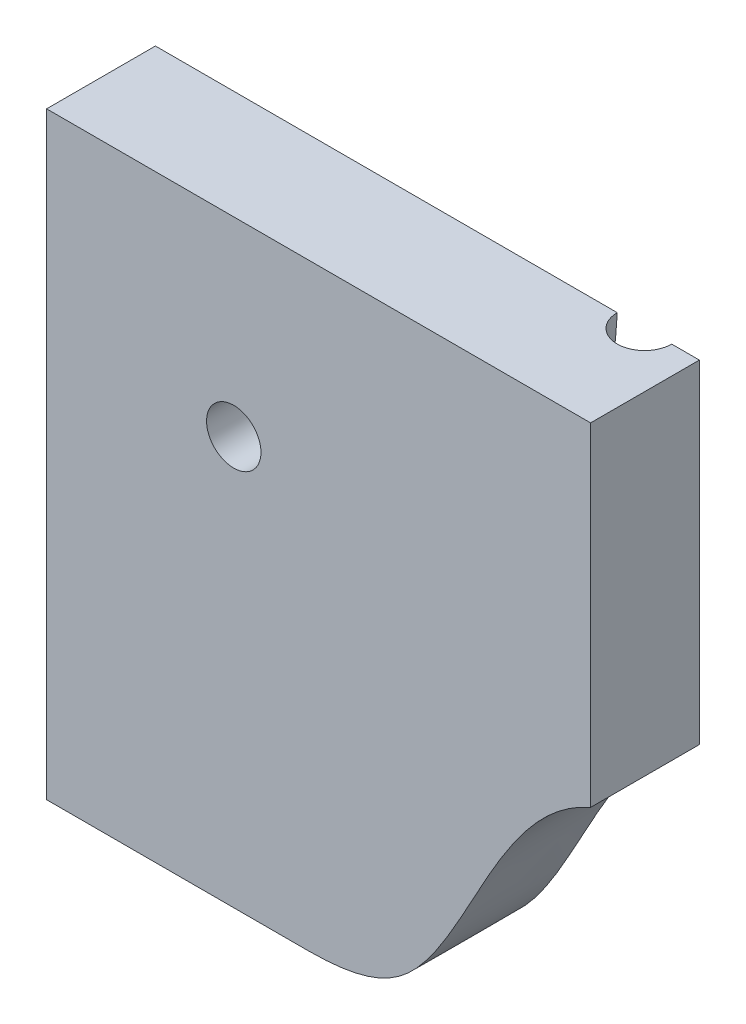
ISO-10303-21;
HEADER;
FILE_DESCRIPTION(('STEP AP214'),'2;1');
FILE_NAME('part.step','',(''),(''),'','','');
FILE_SCHEMA(('AUTOMOTIVE_DESIGN { 1 0 10303 214 1 1 1 1 }'));
ENDSEC;
DATA;
#1=APPLICATION_CONTEXT('core data for automotive mechanical design processes');
#2=APPLICATION_PROTOCOL_DEFINITION('international standard','automotive_design',2000,#1);
#3=PRODUCT_CONTEXT('',#1,'mechanical');
#4=PRODUCT('Part','Part','',(#3));
#5=PRODUCT_RELATED_PRODUCT_CATEGORY('part','',(#4));
#6=PRODUCT_DEFINITION_FORMATION('','',#4);
#7=PRODUCT_DEFINITION_CONTEXT('part definition',#1,'design');
#8=PRODUCT_DEFINITION('design','',#6,#7);
#9=PRODUCT_DEFINITION_SHAPE('','',#8);
#10=(LENGTH_UNIT() NAMED_UNIT(*) SI_UNIT(.MILLI.,.METRE.));
#11=(NAMED_UNIT(*) PLANE_ANGLE_UNIT() SI_UNIT($,.RADIAN.));
#12=(NAMED_UNIT(*) SI_UNIT($,.STERADIAN.) SOLID_ANGLE_UNIT());
#13=UNCERTAINTY_MEASURE_WITH_UNIT(LENGTH_MEASURE(1.E-05),#10,'distance_accuracy_value','');
#14=(GEOMETRIC_REPRESENTATION_CONTEXT(3) GLOBAL_UNCERTAINTY_ASSIGNED_CONTEXT((#13)) GLOBAL_UNIT_ASSIGNED_CONTEXT((#10,
#11,#12)) REPRESENTATION_CONTEXT('',''));
#15=CARTESIAN_POINT('',(0.,0.,0.));
#16=DIRECTION('',(0.,0.,1.));
#17=DIRECTION('',(1.,0.,0.));
#18=AXIS2_PLACEMENT_3D('',#15,#16,#17);
#19=CARTESIAN_POINT('',(38.2647547534457,10.0098254795269,0.));
#20=DIRECTION('',(0.,0.,-1.));
#21=DIRECTION('',(-1.,0.,0.));
#22=AXIS2_PLACEMENT_3D('',#19,#20,#21);
#23=PLANE('',#22);
#24=CARTESIAN_POINT('',(17.2,37.5,0.));
#25=DIRECTION('',(0.,0.,-1.));
#26=DIRECTION('',(-1.,0.,0.));
#27=AXIS2_PLACEMENT_3D('',#24,#25,#26);
#28=CIRCLE('',#27,2.5000000000842);
#29=CARTESIAN_POINT('',(14.6999999999158,37.5,0.));
#30=VERTEX_POINT('',#29);
#31=EDGE_CURVE('E160',#30,#30,#28,.F.);
#32=ORIENTED_EDGE('',*,*,#31,.T.);
#33=EDGE_LOOP('',(#32));
#34=FACE_BOUND('',#33,.T.);
#35=CARTESIAN_POINT('',(42.5,57.,0.));
#36=CARTESIAN_POINT('',(42.5000000006538,51.9253380487951,0.));
#37=CARTESIAN_POINT('',(41.5531151539756,46.4013222350396,0.));
#38=CARTESIAN_POINT('',(38.3409411286107,38.4417646806979,0.));
#39=CARTESIAN_POINT('',(36.973235797455,35.8352441280092,0.));
#40=CARTESIAN_POINT('',(33.6915817568519,30.9261746060751,0.));
#41=CARTESIAN_POINT('',(31.771503076357,28.6150238978217,0.));
#42=CARTESIAN_POINT('',(27.4982759398184,24.4580256174074,0.));
#43=CARTESIAN_POINT('',(25.1383219375729,22.6054937700866,0.));
#44=CARTESIAN_POINT('',(20.1558797146555,19.4679096422306,0.));
#45=CARTESIAN_POINT('',(17.5261590397284,18.1774846024586,0.));
#46=CARTESIAN_POINT('',(12.1919874742694,16.1868966847282,0.));
#47=CARTESIAN_POINT('',(9.47903854419933,15.4827671330933,0.));
#48=CARTESIAN_POINT('',(4.15156445206141,14.6172527598869,0.));
#49=CARTESIAN_POINT('',(1.52516480725778,14.4582368787778,0.));
#50=CARTESIAN_POINT('',(-1.00015293756699,14.5108584228348,0.));
#51=B_SPLINE_CURVE_WITH_KNOTS('',3,(#35,#36,#37,#38,#39,#40,#41,#42,#43,#44,#45,#46,#47,#48,#49,
#50),.UNSPECIFIED.,.F.,.F.,(4,2,2,2,2,2,2,4),(0.,0.25,0.375,0.5,0.625,0.75,0.875,1.),.UNSPECIFIED.);
#52=CARTESIAN_POINT('',(0.,14.5012176124524,0.));
#53=VERTEX_POINT('',#52);
#54=CARTESIAN_POINT('',(42.4514698092519,55.,0.));
#55=VERTEX_POINT('',#54);
#56=EDGE_CURVE('E11',#53,#55,#51,.F.);
#57=ORIENTED_EDGE('',*,*,#56,.F.);
#58=DIRECTION('',(0.,-1.,0.));
#59=VECTOR('',#58,1.);
#60=CARTESIAN_POINT('',(0.,0.,0.));
#61=LINE('',#60,#59);
#62=CARTESIAN_POINT('',(0.,55.,0.));
#63=VERTEX_POINT('',#62);
#64=EDGE_CURVE('E138',#63,#53,#61,.T.);
#65=ORIENTED_EDGE('',*,*,#64,.F.);
#66=DIRECTION('',(-1.,0.,0.));
#67=VECTOR('',#66,1.);
#68=CARTESIAN_POINT('',(0.,55.,0.));
#69=LINE('',#68,#67);
#70=EDGE_CURVE('E135',#55,#63,#69,.T.);
#71=ORIENTED_EDGE('',*,*,#70,.F.);
#72=EDGE_LOOP('',(#57,#65,#71));
#73=FACE_BOUND('',#72,.T.);
#74=ADVANCED_FACE('F33',(#34,#73),#23,.T.);
#75=CARTESIAN_POINT('',(0.,0.,10.));
#76=DIRECTION('',(0.,1.,0.));
#77=DIRECTION('',(0.,0.,1.));
#78=AXIS2_PLACEMENT_3D('',#75,#76,#77);
#79=PLANE('',#78);
#80=DIRECTION('',(1.,0.,0.));
#81=VECTOR('',#80,1.);
#82=CARTESIAN_POINT('',(0.,0.,0.));
#83=LINE('',#82,#81);
#84=CARTESIAN_POINT('',(0.,0.,0.));
#85=VERTEX_POINT('',#84);
#86=CARTESIAN_POINT('',(24.,0.,0.));
#87=VERTEX_POINT('',#86);
#88=EDGE_CURVE('E124',#85,#87,#83,.T.);
#89=ORIENTED_EDGE('',*,*,#88,.T.);
#90=DIRECTION('',(0.,0.,-1.));
#91=VECTOR('',#90,1.);
#92=CARTESIAN_POINT('',(24.,0.,10.));
#93=LINE('',#92,#91);
#94=CARTESIAN_POINT('',(24.,0.,10.));
#95=VERTEX_POINT('',#94);
#96=EDGE_CURVE('E145',#95,#87,#93,.T.);
#97=ORIENTED_EDGE('',*,*,#96,.F.);
#98=DIRECTION('',(1.,0.,0.));
#99=VECTOR('',#98,1.);
#100=CARTESIAN_POINT('',(0.,0.,10.));
#101=LINE('',#100,#99);
#102=CARTESIAN_POINT('',(0.,0.,10.));
#103=VERTEX_POINT('',#102);
#104=EDGE_CURVE('E141',#103,#95,#101,.T.);
#105=ORIENTED_EDGE('',*,*,#104,.F.);
#106=DIRECTION('',(0.,0.,-1.));
#107=VECTOR('',#106,1.);
#108=CARTESIAN_POINT('',(0.,0.,10.));
#109=LINE('',#108,#107);
#110=EDGE_CURVE('E120',#103,#85,#109,.T.);
#111=ORIENTED_EDGE('',*,*,#110,.T.);
#112=EDGE_LOOP('',(#89,#97,#105,#111));
#113=FACE_BOUND('',#112,.T.);
#114=ADVANCED_FACE('F35',(#113),#79,.F.);
#115=CARTESIAN_POINT('',(24.,0.,10.));
#116=CARTESIAN_POINT('',(29.8352147172741,0.,10.));
#117=CARTESIAN_POINT('',(38.1427017924434,5.23965862310339,10.));
#118=CARTESIAN_POINT('',(42.219386104431,21.0249690236079,10.));
#119=CARTESIAN_POINT('',(50.,24.39,10.));
#120=B_SPLINE_CURVE_WITH_KNOTS('',3,(#115,#116,#117,#118,#119),.UNSPECIFIED.,.F.,.F.,(4,1,4),
(0.,0.308376464465962,1.),.UNSPECIFIED.);
#121=DIRECTION('',(0.,0.,-1.));
#122=VECTOR('',#121,1.);
#123=SURFACE_OF_LINEAR_EXTRUSION('',#120,#122);
#124=CARTESIAN_POINT('',(24.,0.,0.));
#125=CARTESIAN_POINT('',(29.8352147172741,0.,0.));
#126=CARTESIAN_POINT('',(38.1427017924434,5.23965862310339,0.));
#127=CARTESIAN_POINT('',(42.219386104431,21.0249690236079,0.));
#128=CARTESIAN_POINT('',(50.,24.39,0.));
#129=B_SPLINE_CURVE_WITH_KNOTS('',3,(#124,#125,#126,#127,#128),.UNSPECIFIED.,.F.,.F.,(4,1,4),
(0.,0.308376464465962,1.),.UNSPECIFIED.);
#130=CARTESIAN_POINT('',(50.,24.39,0.));
#131=VERTEX_POINT('',#130);
#132=EDGE_CURVE('E127',#87,#131,#129,.T.);
#133=ORIENTED_EDGE('',*,*,#132,.T.);
#134=DIRECTION('',(0.,0.,-1.));
#135=VECTOR('',#134,1.);
#136=CARTESIAN_POINT('',(50.,24.39,10.));
#137=LINE('',#136,#135);
#138=CARTESIAN_POINT('',(50.,24.39,10.));
#139=VERTEX_POINT('',#138);
#140=EDGE_CURVE('E114',#139,#131,#137,.T.);
#141=ORIENTED_EDGE('',*,*,#140,.F.);
#142=EDGE_CURVE('E91',#95,#139,#120,.T.);
#143=ORIENTED_EDGE('',*,*,#142,.F.);
#144=ORIENTED_EDGE('',*,*,#96,.T.);
#145=EDGE_LOOP('',(#133,#141,#143,#144));
#146=FACE_BOUND('',#145,.T.);
#147=ADVANCED_FACE('F212',(#146),#123,.F.);
#148=CARTESIAN_POINT('',(50.,55.,10.));
#149=DIRECTION('',(-1.,0.,0.));
#150=DIRECTION('',(0.,-1.,0.));
#151=AXIS2_PLACEMENT_3D('',#148,#149,#150);
#152=PLANE('',#151);
#153=DIRECTION('',(0.,1.,0.));
#154=VECTOR('',#153,1.);
#155=CARTESIAN_POINT('',(50.,55.,0.));
#156=LINE('',#155,#154);
#157=CARTESIAN_POINT('',(50.,55.,0.));
#158=VERTEX_POINT('',#157);
#159=EDGE_CURVE('E110',#131,#158,#156,.T.);
#160=ORIENTED_EDGE('',*,*,#159,.T.);
#161=DIRECTION('',(0.,0.,-1.));
#162=VECTOR('',#161,1.);
#163=CARTESIAN_POINT('',(50.,55.,10.));
#164=LINE('',#163,#162);
#165=CARTESIAN_POINT('',(50.,55.,10.));
#166=VERTEX_POINT('',#165);
#167=EDGE_CURVE('E107',#166,#158,#164,.T.);
#168=ORIENTED_EDGE('',*,*,#167,.F.);
#169=DIRECTION('',(0.,1.,0.));
#170=VECTOR('',#169,1.);
#171=CARTESIAN_POINT('',(50.,55.,10.));
#172=LINE('',#171,#170);
#173=EDGE_CURVE('E97',#139,#166,#172,.T.);
#174=ORIENTED_EDGE('',*,*,#173,.F.);
#175=ORIENTED_EDGE('',*,*,#140,.T.);
#176=EDGE_LOOP('',(#160,#168,#174,#175));
#177=FACE_BOUND('',#176,.T.);
#178=ADVANCED_FACE('F108',(#177),#152,.F.);
#179=CARTESIAN_POINT('',(0.,55.,10.));
#180=DIRECTION('',(0.,-1.,0.));
#181=DIRECTION('',(0.,0.,-1.));
#182=AXIS2_PLACEMENT_3D('',#179,#180,#181);
#183=PLANE('',#182);
#184=CARTESIAN_POINT('',(47.4568555946469,55.,0.));
#185=VERTEX_POINT('',#184);
#186=EDGE_CURVE('E136',#158,#185,#69,.T.);
#187=ORIENTED_EDGE('',*,*,#186,.T.);
#188=CARTESIAN_POINT('',(47.4568555946469,55.,0.));
#189=CARTESIAN_POINT('',(47.4568623708793,55.,0.0702648939159161));
#190=CARTESIAN_POINT('',(47.4538904852355,55.,0.140526573017456));
#191=CARTESIAN_POINT('',(47.442041824152,55.,0.280546893510559));
#192=CARTESIAN_POINT('',(47.4331653421898,55.,0.350305559729305));
#193=CARTESIAN_POINT('',(47.40956851912,55.,0.488779823353157));
#194=CARTESIAN_POINT('',(47.3948524440054,55.,0.557496144259975));
#195=CARTESIAN_POINT('',(47.3596963979197,55.,0.693427968661049));
#196=CARTESIAN_POINT('',(47.3392564945323,55.,0.760643489865761));
#197=CARTESIAN_POINT('',(47.2695183998098,55.,0.959387102448081));
#198=CARTESIAN_POINT('',(47.211791561359,55.,1.08807213968848));
#199=CARTESIAN_POINT('',(47.0756008847293,55.,1.33383292830919));
#200=CARTESIAN_POINT('',(46.997140974646,55.,1.45091087300155));
#201=CARTESIAN_POINT('',(46.8216505600416,55.,1.67031486399083));
#202=CARTESIAN_POINT('',(46.7246120514826,55.,1.77263451868155));
#203=CARTESIAN_POINT('',(46.5147354203153,55.,1.95955877369636));
#204=CARTESIAN_POINT('',(46.4018948401067,55.,2.04416061335896));
#205=CARTESIAN_POINT('',(46.1635226103419,55.,2.19331465627374));
#206=CARTESIAN_POINT('',(46.0379799845037,55.,2.25784931923312));
#207=CARTESIAN_POINT('',(45.7778572992051,55.,2.36494364852608));
#208=CARTESIAN_POINT('',(45.643277768906,55.,2.40750460027749));
#209=CARTESIAN_POINT('',(45.3687580828219,55.,2.46949108001671));
#210=CARTESIAN_POINT('',(45.2288129372254,55.,2.48889450599971));
#211=CARTESIAN_POINT('',(44.947642919291,55.,2.50394296510746));
#212=CARTESIAN_POINT('',(44.806418012416,55.,2.4995873551264));
#213=CARTESIAN_POINT('',(44.5266412821531,55.,2.46724523838534));
#214=CARTESIAN_POINT('',(44.388090963704,55.,2.43924580259765));
#215=CARTESIAN_POINT('',(44.1175940612239,55.,2.36033921992151));
#216=CARTESIAN_POINT('',(43.9856474598996,55.,2.30943213302506));
#217=CARTESIAN_POINT('',(43.7956666437165,55.,2.21708326981605));
#218=CARTESIAN_POINT('',(43.7336358513023,55.,2.18361629528253));
#219=CARTESIAN_POINT('',(43.6126124845674,55.,2.11157533993583));
#220=CARTESIAN_POINT('',(43.55361920705,55.,2.0730025485901));
#221=CARTESIAN_POINT('',(43.4391207612037,55.,1.99103592660528));
#222=CARTESIAN_POINT('',(43.3836141388032,55.,1.94764412686189));
#223=CARTESIAN_POINT('',(43.2764126780997,55.,1.85630635516975));
#224=CARTESIAN_POINT('',(43.2247215862654,55.,1.80835601013701));
#225=CARTESIAN_POINT('',(43.0761476337713,55.,1.65834509604768));
#226=CARTESIAN_POINT('',(42.9855203926245,55.,1.54994981940076));
#227=CARTESIAN_POINT('',(42.8238082500325,55.,1.31945513463973));
#228=CARTESIAN_POINT('',(42.7527224116425,55.,1.1973563839568));
#229=CARTESIAN_POINT('',(42.6622758114028,55.,1.00667789322266));
#230=CARTESIAN_POINT('',(42.6348147232992,55.,0.941830549025652));
#231=CARTESIAN_POINT('',(42.5854750549876,55.,0.810087020293698));
#232=CARTESIAN_POINT('',(42.5635919564041,55.,0.743192543529586));
#233=CARTESIAN_POINT('',(42.5255682313005,55.,0.607869056184087));
#234=CARTESIAN_POINT('',(42.509421937976,55.,0.53944163129186));
#235=CARTESIAN_POINT('',(42.4829572604698,55.,0.401481732782834));
#236=CARTESIAN_POINT('',(42.4726371580063,55.,0.331949591199617));
#237=CARTESIAN_POINT('',(42.460666972768,55.,0.21855461096321));
#238=CARTESIAN_POINT('',(42.4572158538575,55.,0.174873913796269));
#239=CARTESIAN_POINT('',(42.4526189346255,55.,0.0874636896438956));
#240=CARTESIAN_POINT('',(42.4514693388725,55.,0.0437343622368296));
#241=CARTESIAN_POINT('',(42.4514698092519,55.,0.));
#242=B_SPLINE_CURVE_WITH_KNOTS('',3,(#188,#189,#190,#191,#192,#193,#194,#195,#196,#197,#198,
#199,#200,#201,#202,#203,#204,#205,#206,#207,#208,#209,#210,#211,#212,#213,#214,#215,#216,#217,
#218,#219,#220,#221,#222,#223,#224,#225,#226,#227,#228,#229,#230,#231,#232,#233,#234,#235,#236,
#237,#238,#239,#240,#241),.UNSPECIFIED.,.F.,.F.,(4,2,2,2,2,2,2,2,2,2,2,2,2,2,2,2,2,2,2,2,2,2,2,
2,2,2,4),(0.,0.210726062439781,0.421441651895574,0.632003590030021,0.842563042076186,
1.26350193366707,1.68436113112706,2.10540205295756,2.52650852960349,2.94798205847605,
3.36943092920193,3.79128171829109,4.21314392602706,4.6352369679275,5.05732890443031,
5.26857170865013,5.47976538739624,5.69087039721725,5.90218000719581,6.32391093804175,
6.74562164477232,6.95667878086567,7.16756440573312,7.37824113524605,7.58885569869703,
7.72025052778673,7.85142849517873),.UNSPECIFIED.);
#243=EDGE_CURVE('E49',#185,#55,#242,.T.);
#244=ORIENTED_EDGE('',*,*,#243,.T.);
#245=ORIENTED_EDGE('',*,*,#70,.T.);
#246=DIRECTION('',(0.,0.,-1.));
#247=VECTOR('',#246,1.);
#248=CARTESIAN_POINT('',(0.,55.,10.));
#249=LINE('',#248,#247);
#250=CARTESIAN_POINT('',(0.,55.,10.));
#251=VERTEX_POINT('',#250);
#252=EDGE_CURVE('E115',#251,#63,#249,.T.);
#253=ORIENTED_EDGE('',*,*,#252,.F.);
#254=DIRECTION('',(-1.,0.,0.));
#255=VECTOR('',#254,1.);
#256=CARTESIAN_POINT('',(0.,55.,10.));
#257=LINE('',#256,#255);
#258=EDGE_CURVE('E101',#166,#251,#257,.T.);
#259=ORIENTED_EDGE('',*,*,#258,.F.);
#260=ORIENTED_EDGE('',*,*,#167,.T.);
#261=EDGE_LOOP('',(#187,#244,#245,#253,#259,#260));
#262=FACE_BOUND('',#261,.T.);
#263=ADVANCED_FACE('F117',(#262),#183,.F.);
#264=CARTESIAN_POINT('',(0.,0.,10.));
#265=DIRECTION('',(1.,0.,0.));
#266=DIRECTION('',(0.,0.,-1.));
#267=AXIS2_PLACEMENT_3D('',#264,#265,#266);
#268=PLANE('',#267);
#269=ORIENTED_EDGE('',*,*,#64,.T.);
#270=CARTESIAN_POINT('',(-2.67825041658232E-13,9.50123213656066,0.));
#271=CARTESIAN_POINT('',(0.,9.50122540068782,0.070314845686527));
#272=CARTESIAN_POINT('',(0.,9.50419861037009,0.14062649626872));
#273=CARTESIAN_POINT('',(0.,9.5160527904368,0.280746762836435));
#274=CARTESIAN_POINT('',(0.,9.52493347798262,0.350555402743394));
#275=CARTESIAN_POINT('',(0.,9.54854219323776,0.48913111560415));
#276=CARTESIAN_POINT('',(0.,9.56326610684729,0.557898886123407));
#277=CARTESIAN_POINT('',(0.,9.59844182404334,0.693932821425435));
#278=CARTESIAN_POINT('',(0.,9.61889355801923,0.761199004446385));
#279=CARTESIAN_POINT('',(0.,9.68867455696585,0.960093953412169));
#280=CARTESIAN_POINT('',(0.,9.74643966872951,1.08887779485323));
#281=CARTESIAN_POINT('',(0.,9.88273128258306,1.33482222990012));
#282=CARTESIAN_POINT('',(0.,9.96125370542873,1.45198510105415));
#283=CARTESIAN_POINT('',(0.,10.1368617274998,1.67148821351709));
#284=CARTESIAN_POINT('',(0.,10.2339477113285,1.77382814764447));
#285=CARTESIAN_POINT('',(0.,10.443936115069,1.96076659634398));
#286=CARTESIAN_POINT('',(0.,10.5568409412639,2.04536240687104));
#287=CARTESIAN_POINT('',(0.,10.7952462054564,2.19439442310009));
#288=CARTESIAN_POINT('',(0.,10.9207460517352,2.25883157527817));
#289=CARTESIAN_POINT('',(0.,11.1807746204466,2.36571686347314));
#290=CARTESIAN_POINT('',(0.,11.3153027645486,2.40816640644638));
#291=CARTESIAN_POINT('',(0.,11.5895774762622,2.4698797774023));
#292=CARTESIAN_POINT('',(0.,11.7293241372498,2.4891431903055));
#293=CARTESIAN_POINT('',(0.,12.0100758484459,2.50393246704834));
#294=CARTESIAN_POINT('',(0.,12.1510809275123,2.49945778512623));
#295=CARTESIAN_POINT('',(0.,12.43031969686,2.4669104771072));
#296=CARTESIAN_POINT('',(0.,12.5685534179945,2.43883811386974));
#297=CARTESIAN_POINT('',(0.,12.8384095386283,2.35984198446587));
#298=CARTESIAN_POINT('',(0.,12.9700319590935,2.30891829077115));
#299=CARTESIAN_POINT('',(0.,13.1595382852102,2.21658890833924));
#300=CARTESIAN_POINT('',(0.,13.2214156954607,2.18313377497947));
#301=CARTESIAN_POINT('',(0.,13.3421356792443,2.11113212448887));
#302=CARTESIAN_POINT('',(0.,13.4009789520708,2.07258678788258));
#303=CARTESIAN_POINT('',(0.,13.5151834436357,1.99069126435227));
#304=CARTESIAN_POINT('',(0.,13.5705461002822,1.9473430822921));
#305=CARTESIAN_POINT('',(0.,13.6774678461422,1.85610944315271));
#306=CARTESIAN_POINT('',(0.,13.7290232131766,1.80821964776341));
#307=CARTESIAN_POINT('',(0.,13.8772845283559,1.65833787530844));
#308=CARTESIAN_POINT('',(0.,13.9677389070811,1.5500234145117));
#309=CARTESIAN_POINT('',(0.,14.1291463966875,1.31973259465839));
#310=CARTESIAN_POINT('',(0.,14.2001002487879,1.19775675512193));
#311=CARTESIAN_POINT('',(0.,14.2904289698735,1.00721627801829));
#312=CARTESIAN_POINT('',(0.,14.317875017014,0.942368552254907));
#313=CARTESIAN_POINT('',(0.,14.3671892197706,0.810627155980245));
#314=CARTESIAN_POINT('',(0.,14.3890618930775,0.743735192075532));
#315=CARTESIAN_POINT('',(0.,14.4270710425265,0.608418429803441));
#316=CARTESIAN_POINT('',(0.,14.4432131325722,0.539995201784398));
#317=CARTESIAN_POINT('',(0.,14.4696765318646,0.402044968812576));
#318=CARTESIAN_POINT('',(0.,14.4799995461119,0.33251829331721));
#319=CARTESIAN_POINT('',(0.,14.4919912022806,0.219033646511648));
#320=CARTESIAN_POINT('',(0.,14.4954533076615,0.175257277195341));
#321=CARTESIAN_POINT('',(0.,14.5000648408243,0.0876554795082916));
#322=CARTESIAN_POINT('',(0.,14.5012180823707,0.0438302518781351));
#323=CARTESIAN_POINT('',(0.,14.5012176124524,0.));
#324=B_SPLINE_CURVE_WITH_KNOTS('',3,(#270,#271,#272,#273,#274,#275,#276,#277,#278,#279,#280,
#281,#282,#283,#284,#285,#286,#287,#288,#289,#290,#291,#292,#293,#294,#295,#296,#297,#298,#299,
#300,#301,#302,#303,#304,#305,#306,#307,#308,#309,#310,#311,#312,#313,#314,#315,#316,#317,#318,
#319,#320,#321,#322,#323),.UNSPECIFIED.,.F.,.F.,(4,2,2,2,2,2,2,2,2,2,2,2,2,2,2,2,2,2,2,2,2,2,2,
2,2,2,4),(0.,0.210875936412851,0.421741777220032,0.632459414220221,0.843174490464591,
1.26442830267909,1.68559939120475,2.10677920657592,2.52802315941138,2.94924733130775,
3.37044454632755,3.79164930153276,4.21286374068446,4.63407348790331,5.05528189928875,
5.26610358899045,5.47687647032262,5.68756169734462,5.8984502453841,6.3196685447673,
6.74087083133631,6.95191170092845,7.16278095592447,7.37344306136853,7.58404341027272,
7.71572669780885,7.84719229179057),.UNSPECIFIED.);
#325=CARTESIAN_POINT('',(0.,9.50123213656066,0.));
#326=VERTEX_POINT('',#325);
#327=EDGE_CURVE('E155',#326,#53,#324,.T.);
#328=ORIENTED_EDGE('',*,*,#327,.F.);
#329=EDGE_CURVE('E82',#326,#85,#61,.T.);
#330=ORIENTED_EDGE('',*,*,#329,.T.);
#331=ORIENTED_EDGE('',*,*,#110,.F.);
#332=DIRECTION('',(0.,-1.,0.));
#333=VECTOR('',#332,1.);
#334=CARTESIAN_POINT('',(0.,0.,10.));
#335=LINE('',#334,#333);
#336=EDGE_CURVE('E58',#251,#103,#335,.T.);
#337=ORIENTED_EDGE('',*,*,#336,.F.);
#338=ORIENTED_EDGE('',*,*,#252,.T.);
#339=EDGE_LOOP('',(#269,#328,#330,#331,#337,#338));
#340=FACE_BOUND('',#339,.T.);
#341=ADVANCED_FACE('F158',(#340),#268,.F.);
#342=CARTESIAN_POINT('',(38.2647547534457,10.0098254795269,10.));
#343=DIRECTION('',(0.,0.,-1.));
#344=DIRECTION('',(-1.,0.,0.));
#345=AXIS2_PLACEMENT_3D('',#342,#343,#344);
#346=PLANE('',#345);
#347=CARTESIAN_POINT('',(17.2,37.5,10.));
#348=DIRECTION('',(0.,0.,1.));
#349=DIRECTION('',(1.,0.,0.));
#350=AXIS2_PLACEMENT_3D('',#347,#348,#349);
#351=CIRCLE('',#350,2.5000000000842);
#352=CARTESIAN_POINT('',(19.7000000000842,37.5,10.));
#353=VERTEX_POINT('',#352);
#354=EDGE_CURVE('E216',#353,#353,#351,.T.);
#355=ORIENTED_EDGE('',*,*,#354,.F.);
#356=EDGE_LOOP('',(#355));
#357=FACE_BOUND('',#356,.T.);
#358=ORIENTED_EDGE('',*,*,#104,.T.);
#359=ORIENTED_EDGE('',*,*,#142,.T.);
#360=ORIENTED_EDGE('',*,*,#173,.T.);
#361=ORIENTED_EDGE('',*,*,#258,.T.);
#362=ORIENTED_EDGE('',*,*,#336,.T.);
#363=EDGE_LOOP('',(#358,#359,#360,#361,#362));
#364=FACE_BOUND('',#363,.T.);
#365=ADVANCED_FACE('F99',(#357,#364),#346,.F.);
#366=CARTESIAN_POINT('',(47.5,57.,0.));
#367=CARTESIAN_POINT('',(47.5000000006342,51.3140978450396,0.));
#368=CARTESIAN_POINT('',(46.4463996404609,45.1660225579919,0.));
#369=CARTESIAN_POINT('',(42.8492987330856,36.252641083718,0.));
#370=CARTESIAN_POINT('',(41.3251219726072,33.3484048785011,0.));
#371=CARTESIAN_POINT('',(37.6532035292652,27.855533706652,0.));
#372=CARTESIAN_POINT('',(35.5121807572972,25.2783911134872,0.));
#373=CARTESIAN_POINT('',(30.7305134372518,20.6267818741217,0.));
#374=CARTESIAN_POINT('',(28.0989065297316,18.5610554449711,0.));
#375=CARTESIAN_POINT('',(22.5240247286413,15.0503954276187,0.));
#376=CARTESIAN_POINT('',(19.5908869403394,13.6111847661828,0.));
#377=CARTESIAN_POINT('',(13.6235121047169,11.3843002018495,0.));
#378=CARTESIAN_POINT('',(10.6001106066956,10.5993438344969,0.));
#379=CARTESIAN_POINT('',(4.63409274206645,9.63009016353973,0.));
#380=CARTESIAN_POINT('',(1.70053245613362,9.45349724357452,0.));
#381=CARTESIAN_POINT('',(-1.10431829054586,9.51194358266815,0.));
#382=B_SPLINE_CURVE_WITH_KNOTS('',3,(#366,#367,#368,#369,#370,#371,#372,#373,#374,#375,#376,
#377,#378,#379,#380,#381),.UNSPECIFIED.,.F.,.F.,(4,2,2,2,2,2,2,4),(0.,0.25,0.375,0.5,0.625,0.75,
0.875,1.),.UNSPECIFIED.);
#383=EDGE_CURVE('E43',#185,#326,#382,.T.);
#384=ORIENTED_EDGE('',*,*,#383,.F.);
#385=ORIENTED_EDGE('',*,*,#186,.F.);
#386=ORIENTED_EDGE('',*,*,#159,.F.);
#387=ORIENTED_EDGE('',*,*,#132,.F.);
#388=ORIENTED_EDGE('',*,*,#88,.F.);
#389=ORIENTED_EDGE('',*,*,#329,.F.);
#390=EDGE_LOOP('',(#384,#385,#386,#387,#388,#389));
#391=FACE_BOUND('',#390,.T.);
#392=ADVANCED_FACE('F163',(#391),#23,.T.);
#393=CARTESIAN_POINT('',(47.5,57.,0.));
#394=CARTESIAN_POINT('',(47.5000000006342,51.3140978450396,0.));
#395=CARTESIAN_POINT('',(46.4463996404609,45.1660225579919,0.));
#396=CARTESIAN_POINT('',(42.8492987330856,36.252641083718,0.));
#397=CARTESIAN_POINT('',(41.3251219726072,33.3484048785011,0.));
#398=CARTESIAN_POINT('',(37.6532035292652,27.855533706652,0.));
#399=CARTESIAN_POINT('',(35.5121807572972,25.2783911134872,0.));
#400=CARTESIAN_POINT('',(30.7305134372518,20.6267818741217,0.));
#401=CARTESIAN_POINT('',(28.0989065297316,18.5610554449711,0.));
#402=CARTESIAN_POINT('',(22.5240247286413,15.0503954276187,0.));
#403=CARTESIAN_POINT('',(19.5908869403394,13.6111847661828,0.));
#404=CARTESIAN_POINT('',(13.6235121047169,11.3843002018495,0.));
#405=CARTESIAN_POINT('',(10.6001106066956,10.5993438344969,0.));
#406=CARTESIAN_POINT('',(4.63409274206645,9.63009016353973,0.));
#407=CARTESIAN_POINT('',(1.70053245613362,9.45349724357452,0.));
#408=CARTESIAN_POINT('',(-1.10431829054586,9.51194358266815,0.));
#409=CARTESIAN_POINT('',(47.5,57.,5.));
#410=CARTESIAN_POINT('',(47.5000000006342,51.3140978450396,5.));
#411=CARTESIAN_POINT('',(46.4463996404188,45.1660225579919,5.));
#412=CARTESIAN_POINT('',(42.8492987331067,36.252641083718,5.));
#413=CARTESIAN_POINT('',(41.3251219726073,33.3484048785011,5.));
#414=CARTESIAN_POINT('',(37.6532035292652,27.855533706652,5.));
#415=CARTESIAN_POINT('',(35.5121807572972,25.2783911134872,5.));
#416=CARTESIAN_POINT('',(30.7305134372518,20.6267818741217,5.));
#417=CARTESIAN_POINT('',(28.0989065297532,18.5610554449602,5.));
#418=CARTESIAN_POINT('',(22.5240247286196,15.0503954276295,5.));
#419=CARTESIAN_POINT('',(19.5908869403185,13.6111847661828,5.));
#420=CARTESIAN_POINT('',(13.6235121047378,11.3843002018495,5.));
#421=CARTESIAN_POINT('',(10.6001106067154,10.5993438344969,5.));
#422=CARTESIAN_POINT('',(4.6340927420466,9.63009016353972,5.));
#423=CARTESIAN_POINT('',(1.70053245614852,9.45349724357421,5.));
#424=CARTESIAN_POINT('',(-1.10431829054586,9.51194358266814,5.));
#425=CARTESIAN_POINT('',(42.5,57.,5.));
#426=CARTESIAN_POINT('',(42.5000000006538,51.9253380487952,5.));
#427=CARTESIAN_POINT('',(41.5531151539756,46.4013222350396,5.));
#428=CARTESIAN_POINT('',(38.3409411286107,38.4417646806979,5.));
#429=CARTESIAN_POINT('',(36.973235797455,35.8352441280092,5.));
#430=CARTESIAN_POINT('',(33.6915817568519,30.9261746060751,5.));
#431=CARTESIAN_POINT('',(31.771503076357,28.6150238978217,5.));
#432=CARTESIAN_POINT('',(27.4982759398184,24.4580256174074,5.));
#433=CARTESIAN_POINT('',(25.1383219375729,22.6054937700866,5.));
#434=CARTESIAN_POINT('',(20.1558797146555,19.4679096422306,5.));
#435=CARTESIAN_POINT('',(17.5261590397284,18.1774846024586,5.));
#436=CARTESIAN_POINT('',(12.1919874742694,16.1868966847282,5.));
#437=CARTESIAN_POINT('',(9.47903854419933,15.4827671330933,5.));
#438=CARTESIAN_POINT('',(4.15156445206141,14.6172527598869,5.));
#439=CARTESIAN_POINT('',(1.52516480725778,14.4582368787778,5.));
#440=CARTESIAN_POINT('',(-1.00015293756699,14.5108584228348,5.));
#441=CARTESIAN_POINT('',(42.5,57.,0.));
#442=CARTESIAN_POINT('',(42.5000000006538,51.9253380487951,0.));
#443=CARTESIAN_POINT('',(41.5531151539756,46.4013222350396,0.));
#444=CARTESIAN_POINT('',(38.3409411286107,38.4417646806979,0.));
#445=CARTESIAN_POINT('',(36.973235797455,35.8352441280092,0.));
#446=CARTESIAN_POINT('',(33.6915817568519,30.9261746060751,0.));
#447=CARTESIAN_POINT('',(31.771503076357,28.6150238978217,0.));
#448=CARTESIAN_POINT('',(27.4982759398184,24.4580256174074,0.));
#449=CARTESIAN_POINT('',(25.1383219375729,22.6054937700866,0.));
#450=CARTESIAN_POINT('',(20.1558797146555,19.4679096422306,0.));
#451=CARTESIAN_POINT('',(17.5261590397284,18.1774846024586,0.));
#452=CARTESIAN_POINT('',(12.1919874742694,16.1868966847282,0.));
#453=CARTESIAN_POINT('',(9.47903854419933,15.4827671330933,0.));
#454=CARTESIAN_POINT('',(4.15156445206141,14.6172527598869,0.));
#455=CARTESIAN_POINT('',(1.52516480725778,14.4582368787778,0.));
#456=CARTESIAN_POINT('',(-1.00015293756699,14.5108584228348,0.));
#457=(BOUNDED_SURFACE() B_SPLINE_SURFACE(3,3,((#393,#394,#395,#396,#397,#398,#399,#400,#401,
#402,#403,#404,#405,#406,#407,#408),(#409,#410,#411,#412,#413,#414,#415,#416,#417,#418,#419,
#420,#421,#422,#423,#424),(#425,#426,#427,#428,#429,#430,#431,#432,#433,#434,#435,#436,#437,
#438,#439,#440),(#441,#442,#443,#444,#445,#446,#447,#448,#449,#450,#451,#452,#453,#454,#455,
#456)),.UNSPECIFIED.,.F.,.F.,.F.) B_SPLINE_SURFACE_WITH_KNOTS((4,4),(4,2,2,2,2,2,2,4),(0.,1.),
(0.,0.25,0.375,0.5,0.625,0.75,0.875,1.),
.UNSPECIFIED.) GEOMETRIC_REPRESENTATION_ITEM() RATIONAL_B_SPLINE_SURFACE(((1.,1.,1.,1.,1.,1.,1.,
1.,1.,1.,1.,1.,1.,1.,1.,1.),(0.333333333333333,0.333333333333333,0.333333333333333,
0.333333333333333,0.333333333333333,0.333333333333333,0.333333333333333,0.333333333333333,
0.333333333333333,0.333333333333333,0.333333333333333,0.333333333333333,0.333333333333333,
0.333333333333333,0.333333333333333,0.333333333333333),(0.333333333333333,0.333333333333333,
0.333333333333333,0.333333333333333,0.333333333333333,0.333333333333333,0.333333333333333,
0.333333333333333,0.333333333333333,0.333333333333333,0.333333333333333,0.333333333333333,
0.333333333333333,0.333333333333333,0.333333333333333,0.333333333333333),(1.,1.,1.,1.,1.,1.,1.,
1.,1.,1.,1.,1.,1.,1.,1.,1.))) REPRESENTATION_ITEM('') SURFACE());
#458=ORIENTED_EDGE('',*,*,#383,.T.);
#459=ORIENTED_EDGE('',*,*,#327,.T.);
#460=ORIENTED_EDGE('',*,*,#56,.T.);
#461=ORIENTED_EDGE('',*,*,#243,.F.);
#462=EDGE_LOOP('',(#458,#459,#460,#461));
#463=FACE_BOUND('',#462,.T.);
#464=ADVANCED_FACE('F153',(#463),#457,.F.);
#465=CARTESIAN_POINT('',(17.2,37.5,-7.07106781210364));
#466=DIRECTION('',(0.,0.,1.));
#467=DIRECTION('',(1.,0.,0.));
#468=AXIS2_PLACEMENT_3D('',#465,#466,#467);
#469=CYLINDRICAL_SURFACE('',#468,2.5000000000842);
#470=ORIENTED_EDGE('',*,*,#354,.T.);
#471=EDGE_LOOP('',(#470));
#472=FACE_BOUND('',#471,.T.);
#473=ORIENTED_EDGE('',*,*,#31,.F.);
#474=EDGE_LOOP('',(#473));
#475=FACE_BOUND('',#474,.T.);
#476=ADVANCED_FACE('F190',(#472,#475),#469,.F.);
#477=CLOSED_SHELL('',(#74,#114,#147,#178,#263,#341,#365,#392,#464,#476));
#478=MANIFOLD_SOLID_BREP('B2',#477);
#479=ADVANCED_BREP_SHAPE_REPRESENTATION('',(#18,#478),#14);
#480=SHAPE_DEFINITION_REPRESENTATION(#9,#479);
ENDSEC;
END-ISO-10303-21;
